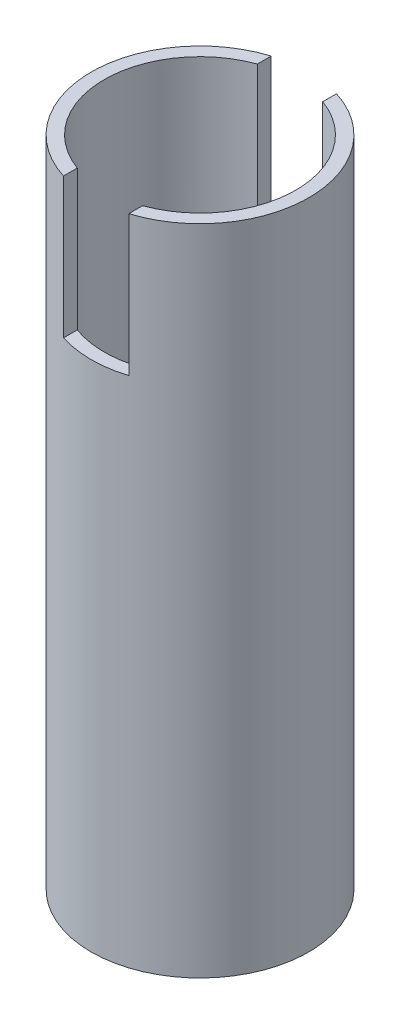
ISO-10303-21;
HEADER;
FILE_DESCRIPTION(('STEP AP214'),'2;1');
FILE_NAME('part.step','',(''),(''),'','','');
FILE_SCHEMA(('AUTOMOTIVE_DESIGN { 1 0 10303 214 1 1 1 1 }'));
ENDSEC;
DATA;
#1=APPLICATION_CONTEXT('core data for automotive mechanical design processes');
#2=APPLICATION_PROTOCOL_DEFINITION('international standard','automotive_design',2000,#1);
#3=PRODUCT_CONTEXT('',#1,'mechanical');
#4=PRODUCT('Part','Part','',(#3));
#5=PRODUCT_RELATED_PRODUCT_CATEGORY('part','',(#4));
#6=PRODUCT_DEFINITION_FORMATION('','',#4);
#7=PRODUCT_DEFINITION_CONTEXT('part definition',#1,'design');
#8=PRODUCT_DEFINITION('design','',#6,#7);
#9=PRODUCT_DEFINITION_SHAPE('','',#8);
#10=(LENGTH_UNIT() NAMED_UNIT(*) SI_UNIT(.MILLI.,.METRE.));
#11=(NAMED_UNIT(*) PLANE_ANGLE_UNIT() SI_UNIT($,.RADIAN.));
#12=(NAMED_UNIT(*) SI_UNIT($,.STERADIAN.) SOLID_ANGLE_UNIT());
#13=UNCERTAINTY_MEASURE_WITH_UNIT(LENGTH_MEASURE(1.E-05),#10,'distance_accuracy_value','');
#14=(GEOMETRIC_REPRESENTATION_CONTEXT(3) GLOBAL_UNCERTAINTY_ASSIGNED_CONTEXT((#13)) GLOBAL_UNIT_ASSIGNED_CONTEXT((#10,
#11,#12)) REPRESENTATION_CONTEXT('',''));
#15=CARTESIAN_POINT('',(0.,0.,0.));
#16=DIRECTION('',(0.,0.,1.));
#17=DIRECTION('',(1.,0.,0.));
#18=AXIS2_PLACEMENT_3D('',#15,#16,#17);
#19=CARTESIAN_POINT('',(0.,150.,0.));
#20=DIRECTION('',(0.,1.,0.));
#21=DIRECTION('',(0.,0.,1.));
#22=AXIS2_PLACEMENT_3D('',#19,#20,#21);
#23=PLANE('',#22);
#24=DIRECTION('',(0.,0.,1.));
#25=VECTOR('',#24,1.);
#26=CARTESIAN_POINT('',(-7.50000000000001,150.,-23.8484800354236));
#27=LINE('',#26,#25);
#28=CARTESIAN_POINT('',(-7.50000000000001,150.,-23.8484800354236));
#29=VERTEX_POINT('',#28);
#30=CARTESIAN_POINT('',(-7.50000000000001,150.,-20.6821178799464));
#31=VERTEX_POINT('',#30);
#32=EDGE_CURVE('E130',#29,#31,#27,.T.);
#33=ORIENTED_EDGE('',*,*,#32,.F.);
#34=CARTESIAN_POINT('',(0.,150.,0.));
#35=DIRECTION('',(0.,1.,0.));
#36=DIRECTION('',(0.,0.,1.));
#37=AXIS2_PLACEMENT_3D('',#34,#35,#36);
#38=CIRCLE('',#37,25.);
#39=CARTESIAN_POINT('',(-7.5,150.,23.8484800354236));
#40=VERTEX_POINT('',#39);
#41=EDGE_CURVE('E45',#29,#40,#38,.T.);
#42=ORIENTED_EDGE('',*,*,#41,.T.);
#43=DIRECTION('',(0.,0.,1.));
#44=VECTOR('',#43,1.);
#45=CARTESIAN_POINT('',(-7.5,150.,20.6821178799464));
#46=LINE('',#45,#44);
#47=CARTESIAN_POINT('',(-7.5,150.,20.6821178799464));
#48=VERTEX_POINT('',#47);
#49=EDGE_CURVE('E142',#48,#40,#46,.T.);
#50=ORIENTED_EDGE('',*,*,#49,.F.);
#51=CARTESIAN_POINT('',(0.,150.,0.));
#52=DIRECTION('',(0.,1.,0.));
#53=DIRECTION('',(0.,0.,1.));
#54=AXIS2_PLACEMENT_3D('',#51,#52,#53);
#55=CIRCLE('',#54,22.);
#56=EDGE_CURVE('E164',#31,#48,#55,.T.);
#57=ORIENTED_EDGE('',*,*,#56,.F.);
#58=EDGE_LOOP('',(#33,#42,#50,#57));
#59=FACE_BOUND('',#58,.T.);
#60=ADVANCED_FACE('F36',(#59),#23,.T.);
#61=DIRECTION('',(0.,0.,-1.));
#62=VECTOR('',#61,1.);
#63=CARTESIAN_POINT('',(7.50000000000001,150.,-20.6821178799464));
#64=LINE('',#63,#62);
#65=CARTESIAN_POINT('',(7.50000000000001,150.,-20.6821178799464));
#66=VERTEX_POINT('',#65);
#67=CARTESIAN_POINT('',(7.50000000000001,150.,-23.8484800354236));
#68=VERTEX_POINT('',#67);
#69=EDGE_CURVE('E110',#66,#68,#64,.T.);
#70=ORIENTED_EDGE('',*,*,#69,.F.);
#71=CARTESIAN_POINT('',(7.5,150.,20.6821178799464));
#72=VERTEX_POINT('',#71);
#73=EDGE_CURVE('E161',#72,#66,#55,.T.);
#74=ORIENTED_EDGE('',*,*,#73,.F.);
#75=DIRECTION('',(0.,0.,-1.));
#76=VECTOR('',#75,1.);
#77=CARTESIAN_POINT('',(7.5,150.,20.6821178799464));
#78=LINE('',#77,#76);
#79=CARTESIAN_POINT('',(7.5,150.,23.8484800354236));
#80=VERTEX_POINT('',#79);
#81=EDGE_CURVE('E139',#80,#72,#78,.T.);
#82=ORIENTED_EDGE('',*,*,#81,.F.);
#83=EDGE_CURVE('E12',#80,#68,#38,.T.);
#84=ORIENTED_EDGE('',*,*,#83,.T.);
#85=EDGE_LOOP('',(#70,#74,#82,#84));
#86=FACE_BOUND('',#85,.T.);
#87=ADVANCED_FACE('F184',(#86),#23,.T.);
#88=CARTESIAN_POINT('',(0.,0.,0.));
#89=DIRECTION('',(0.,1.,0.));
#90=DIRECTION('',(0.,0.,1.));
#91=AXIS2_PLACEMENT_3D('',#88,#89,#90);
#92=PLANE('',#91);
#93=CARTESIAN_POINT('',(0.,0.,0.));
#94=DIRECTION('',(0.,1.,0.));
#95=DIRECTION('',(0.,0.,1.));
#96=AXIS2_PLACEMENT_3D('',#93,#94,#95);
#97=CIRCLE('',#96,25.);
#98=CARTESIAN_POINT('',(0.,0.,25.));
#99=VERTEX_POINT('',#98);
#100=EDGE_CURVE('E40',#99,#99,#97,.T.);
#101=ORIENTED_EDGE('',*,*,#100,.F.);
#102=EDGE_LOOP('',(#101));
#103=FACE_BOUND('',#102,.T.);
#104=CARTESIAN_POINT('',(0.,0.,0.));
#105=DIRECTION('',(0.,1.,0.));
#106=DIRECTION('',(0.,0.,1.));
#107=AXIS2_PLACEMENT_3D('',#104,#105,#106);
#108=CIRCLE('',#107,22.);
#109=CARTESIAN_POINT('',(0.,0.,22.));
#110=VERTEX_POINT('',#109);
#111=EDGE_CURVE('E154',#110,#110,#108,.T.);
#112=ORIENTED_EDGE('',*,*,#111,.T.);
#113=EDGE_LOOP('',(#112));
#114=FACE_BOUND('',#113,.T.);
#115=ADVANCED_FACE('F182',(#103,#114),#92,.F.);
#116=CARTESIAN_POINT('',(0.,150.,0.));
#117=DIRECTION('',(0.,-1.,0.));
#118=DIRECTION('',(0.,0.,-1.));
#119=AXIS2_PLACEMENT_3D('',#116,#117,#118);
#120=CYLINDRICAL_SURFACE('',#119,25.);
#121=ORIENTED_EDGE('',*,*,#41,.F.);
#122=DIRECTION('',(0.,1.,0.));
#123=VECTOR('',#122,1.);
#124=CARTESIAN_POINT('',(-7.50000000000001,102.190896694471,-23.8484800354236));
#125=LINE('',#124,#123);
#126=CARTESIAN_POINT('',(-7.50000000000001,117.8,-23.8484800354236));
#127=VERTEX_POINT('',#126);
#128=EDGE_CURVE('E120',#127,#29,#125,.T.);
#129=ORIENTED_EDGE('',*,*,#128,.F.);
#130=CARTESIAN_POINT('',(0.,117.8,0.));
#131=DIRECTION('',(0.,1.,0.));
#132=DIRECTION('',(0.,0.,1.));
#133=AXIS2_PLACEMENT_3D('',#130,#131,#132);
#134=CIRCLE('',#133,25.);
#135=CARTESIAN_POINT('',(7.50000000000001,117.8,-23.8484800354236));
#136=VERTEX_POINT('',#135);
#137=EDGE_CURVE('E117',#127,#136,#134,.F.);
#138=ORIENTED_EDGE('',*,*,#137,.T.);
#139=DIRECTION('',(0.,1.,0.));
#140=VECTOR('',#139,1.);
#141=CARTESIAN_POINT('',(7.50000000000001,102.190896694471,-23.8484800354236));
#142=LINE('',#141,#140);
#143=EDGE_CURVE('E104',#136,#68,#142,.T.);
#144=ORIENTED_EDGE('',*,*,#143,.T.);
#145=ORIENTED_EDGE('',*,*,#83,.F.);
#146=DIRECTION('',(0.,1.,0.));
#147=VECTOR('',#146,1.);
#148=CARTESIAN_POINT('',(7.5,102.190896694471,23.8484800354236));
#149=LINE('',#148,#147);
#150=CARTESIAN_POINT('',(7.5,117.8,23.8484800354236));
#151=VERTEX_POINT('',#150);
#152=EDGE_CURVE('E149',#151,#80,#149,.T.);
#153=ORIENTED_EDGE('',*,*,#152,.F.);
#154=CARTESIAN_POINT('',(0.,117.8,0.));
#155=DIRECTION('',(0.,1.,0.));
#156=DIRECTION('',(0.,0.,1.));
#157=AXIS2_PLACEMENT_3D('',#154,#155,#156);
#158=CIRCLE('',#157,25.);
#159=CARTESIAN_POINT('',(-7.5,117.8,23.8484800354236));
#160=VERTEX_POINT('',#159);
#161=EDGE_CURVE('E151',#151,#160,#158,.F.);
#162=ORIENTED_EDGE('',*,*,#161,.T.);
#163=DIRECTION('',(0.,1.,0.));
#164=VECTOR('',#163,1.);
#165=CARTESIAN_POINT('',(-7.5,102.190896694471,23.8484800354236));
#166=LINE('',#165,#164);
#167=EDGE_CURVE('E145',#160,#40,#166,.T.);
#168=ORIENTED_EDGE('',*,*,#167,.T.);
#169=EDGE_LOOP('',(#121,#129,#138,#144,#145,#153,#162,#168));
#170=FACE_BOUND('',#169,.T.);
#171=ORIENTED_EDGE('',*,*,#100,.T.);
#172=EDGE_LOOP('',(#171));
#173=FACE_BOUND('',#172,.T.);
#174=ADVANCED_FACE('F38',(#170,#173),#120,.T.);
#175=CARTESIAN_POINT('',(0.,150.,0.));
#176=DIRECTION('',(0.,-1.,0.));
#177=DIRECTION('',(0.,0.,-1.));
#178=AXIS2_PLACEMENT_3D('',#175,#176,#177);
#179=CYLINDRICAL_SURFACE('',#178,22.);
#180=DIRECTION('',(0.,1.,0.));
#181=VECTOR('',#180,1.);
#182=CARTESIAN_POINT('',(-7.50000000000001,102.190896694471,-20.6821178799464));
#183=LINE('',#182,#181);
#184=CARTESIAN_POINT('',(-7.50000000000001,117.8,-20.6821178799464));
#185=VERTEX_POINT('',#184);
#186=EDGE_CURVE('E52',#185,#31,#183,.T.);
#187=ORIENTED_EDGE('',*,*,#186,.T.);
#188=ORIENTED_EDGE('',*,*,#56,.T.);
#189=DIRECTION('',(0.,1.,0.));
#190=VECTOR('',#189,1.);
#191=CARTESIAN_POINT('',(-7.5,102.190896694471,20.6821178799464));
#192=LINE('',#191,#190);
#193=CARTESIAN_POINT('',(-7.50000000000001,117.8,20.6821178799464));
#194=VERTEX_POINT('',#193);
#195=EDGE_CURVE('E125',#194,#48,#192,.T.);
#196=ORIENTED_EDGE('',*,*,#195,.F.);
#197=CARTESIAN_POINT('',(0.,117.8,0.));
#198=DIRECTION('',(0.,1.,0.));
#199=DIRECTION('',(0.,0.,1.));
#200=AXIS2_PLACEMENT_3D('',#197,#198,#199);
#201=CIRCLE('',#200,22.);
#202=CARTESIAN_POINT('',(7.5,117.8,20.6821178799464));
#203=VERTEX_POINT('',#202);
#204=EDGE_CURVE('E141',#194,#203,#201,.T.);
#205=ORIENTED_EDGE('',*,*,#204,.T.);
#206=DIRECTION('',(0.,1.,0.));
#207=VECTOR('',#206,1.);
#208=CARTESIAN_POINT('',(7.5,102.190896694471,20.6821178799464));
#209=LINE('',#208,#207);
#210=EDGE_CURVE('E60',#203,#72,#209,.T.);
#211=ORIENTED_EDGE('',*,*,#210,.T.);
#212=ORIENTED_EDGE('',*,*,#73,.T.);
#213=DIRECTION('',(0.,1.,0.));
#214=VECTOR('',#213,1.);
#215=CARTESIAN_POINT('',(7.50000000000001,102.190896694471,-20.6821178799464));
#216=LINE('',#215,#214);
#217=CARTESIAN_POINT('',(7.49999999999999,117.8,-20.6821178799464));
#218=VERTEX_POINT('',#217);
#219=EDGE_CURVE('E137',#218,#66,#216,.T.);
#220=ORIENTED_EDGE('',*,*,#219,.F.);
#221=CARTESIAN_POINT('',(0.,117.8,0.));
#222=DIRECTION('',(0.,1.,0.));
#223=DIRECTION('',(0.,0.,1.));
#224=AXIS2_PLACEMENT_3D('',#221,#222,#223);
#225=CIRCLE('',#224,22.);
#226=EDGE_CURVE('E119',#218,#185,#225,.T.);
#227=ORIENTED_EDGE('',*,*,#226,.T.);
#228=EDGE_LOOP('',(#187,#188,#196,#205,#211,#212,#220,#227));
#229=FACE_BOUND('',#228,.T.);
#230=ORIENTED_EDGE('',*,*,#111,.F.);
#231=EDGE_LOOP('',(#230));
#232=FACE_BOUND('',#231,.T.);
#233=ADVANCED_FACE('F171',(#229,#232),#179,.F.);
#234=CARTESIAN_POINT('',(7.5,102.190896694471,20.6821178799464));
#235=DIRECTION('',(1.,0.,0.));
#236=DIRECTION('',(0.,0.,-1.));
#237=AXIS2_PLACEMENT_3D('',#234,#235,#236);
#238=PLANE('',#237);
#239=DIRECTION('',(0.,0.,-1.));
#240=VECTOR('',#239,1.);
#241=CARTESIAN_POINT('',(7.5,117.8,20.6821178799464));
#242=LINE('',#241,#240);
#243=EDGE_CURVE('E128',#151,#203,#242,.T.);
#244=ORIENTED_EDGE('',*,*,#243,.F.);
#245=ORIENTED_EDGE('',*,*,#152,.T.);
#246=ORIENTED_EDGE('',*,*,#81,.T.);
#247=ORIENTED_EDGE('',*,*,#210,.F.);
#248=EDGE_LOOP('',(#244,#245,#246,#247));
#249=FACE_BOUND('',#248,.T.);
#250=ADVANCED_FACE('F197',(#249),#238,.F.);
#251=CARTESIAN_POINT('',(-7.5,102.190896694471,20.6821178799464));
#252=DIRECTION('',(-1.,0.,0.));
#253=DIRECTION('',(0.,0.,1.));
#254=AXIS2_PLACEMENT_3D('',#251,#252,#253);
#255=PLANE('',#254);
#256=DIRECTION('',(0.,0.,1.));
#257=VECTOR('',#256,1.);
#258=CARTESIAN_POINT('',(-7.50000000000001,117.8,20.6821178799464));
#259=LINE('',#258,#257);
#260=EDGE_CURVE('E146',#194,#160,#259,.T.);
#261=ORIENTED_EDGE('',*,*,#260,.F.);
#262=ORIENTED_EDGE('',*,*,#195,.T.);
#263=ORIENTED_EDGE('',*,*,#49,.T.);
#264=ORIENTED_EDGE('',*,*,#167,.F.);
#265=EDGE_LOOP('',(#261,#262,#263,#264));
#266=FACE_BOUND('',#265,.T.);
#267=ADVANCED_FACE('F178',(#266),#255,.F.);
#268=CARTESIAN_POINT('',(0.,117.8,0.));
#269=DIRECTION('',(0.,1.,0.));
#270=DIRECTION('',(0.,0.,-1.));
#271=AXIS2_PLACEMENT_3D('',#268,#269,#270);
#272=PLANE('',#271);
#273=ORIENTED_EDGE('',*,*,#260,.T.);
#274=ORIENTED_EDGE('',*,*,#161,.F.);
#275=ORIENTED_EDGE('',*,*,#243,.T.);
#276=ORIENTED_EDGE('',*,*,#204,.F.);
#277=EDGE_LOOP('',(#273,#274,#275,#276));
#278=FACE_BOUND('',#277,.T.);
#279=ADVANCED_FACE('F198',(#278),#272,.T.);
#280=CARTESIAN_POINT('',(-7.50000000000001,102.190896694471,-23.8484800354236));
#281=DIRECTION('',(-1.,0.,0.));
#282=DIRECTION('',(0.,0.,1.));
#283=AXIS2_PLACEMENT_3D('',#280,#281,#282);
#284=PLANE('',#283);
#285=DIRECTION('',(0.,0.,1.));
#286=VECTOR('',#285,1.);
#287=CARTESIAN_POINT('',(-7.50000000000002,117.8,-25.));
#288=LINE('',#287,#286);
#289=EDGE_CURVE('E133',#127,#185,#288,.T.);
#290=ORIENTED_EDGE('',*,*,#289,.F.);
#291=ORIENTED_EDGE('',*,*,#128,.T.);
#292=ORIENTED_EDGE('',*,*,#32,.T.);
#293=ORIENTED_EDGE('',*,*,#186,.F.);
#294=EDGE_LOOP('',(#290,#291,#292,#293));
#295=FACE_BOUND('',#294,.T.);
#296=ADVANCED_FACE('F201',(#295),#284,.F.);
#297=CARTESIAN_POINT('',(7.50000000000001,102.190896694471,-20.6821178799464));
#298=DIRECTION('',(1.,0.,0.));
#299=DIRECTION('',(0.,0.,-1.));
#300=AXIS2_PLACEMENT_3D('',#297,#298,#299);
#301=PLANE('',#300);
#302=DIRECTION('',(0.,0.,-1.));
#303=VECTOR('',#302,1.);
#304=CARTESIAN_POINT('',(7.49999999999999,117.8,-25.));
#305=LINE('',#304,#303);
#306=EDGE_CURVE('E107',#218,#136,#305,.T.);
#307=ORIENTED_EDGE('',*,*,#306,.F.);
#308=ORIENTED_EDGE('',*,*,#219,.T.);
#309=ORIENTED_EDGE('',*,*,#69,.T.);
#310=ORIENTED_EDGE('',*,*,#143,.F.);
#311=EDGE_LOOP('',(#307,#308,#309,#310));
#312=FACE_BOUND('',#311,.T.);
#313=ADVANCED_FACE('F106',(#312),#301,.F.);
#314=CARTESIAN_POINT('',(0.,117.8,0.));
#315=DIRECTION('',(0.,1.,0.));
#316=DIRECTION('',(0.,0.,-1.));
#317=AXIS2_PLACEMENT_3D('',#314,#315,#316);
#318=PLANE('',#317);
#319=ORIENTED_EDGE('',*,*,#306,.T.);
#320=ORIENTED_EDGE('',*,*,#137,.F.);
#321=ORIENTED_EDGE('',*,*,#289,.T.);
#322=ORIENTED_EDGE('',*,*,#226,.F.);
#323=EDGE_LOOP('',(#319,#320,#321,#322));
#324=FACE_BOUND('',#323,.T.);
#325=ADVANCED_FACE('F116',(#324),#318,.T.);
#326=CLOSED_SHELL('',(#60,#87,#115,#174,#233,#250,#267,#279,#296,#313,#325));
#327=MANIFOLD_SOLID_BREP('B2',#326);
#328=ADVANCED_BREP_SHAPE_REPRESENTATION('',(#18,#327),#14);
#329=SHAPE_DEFINITION_REPRESENTATION(#9,#328);
ENDSEC;
END-ISO-10303-21;
